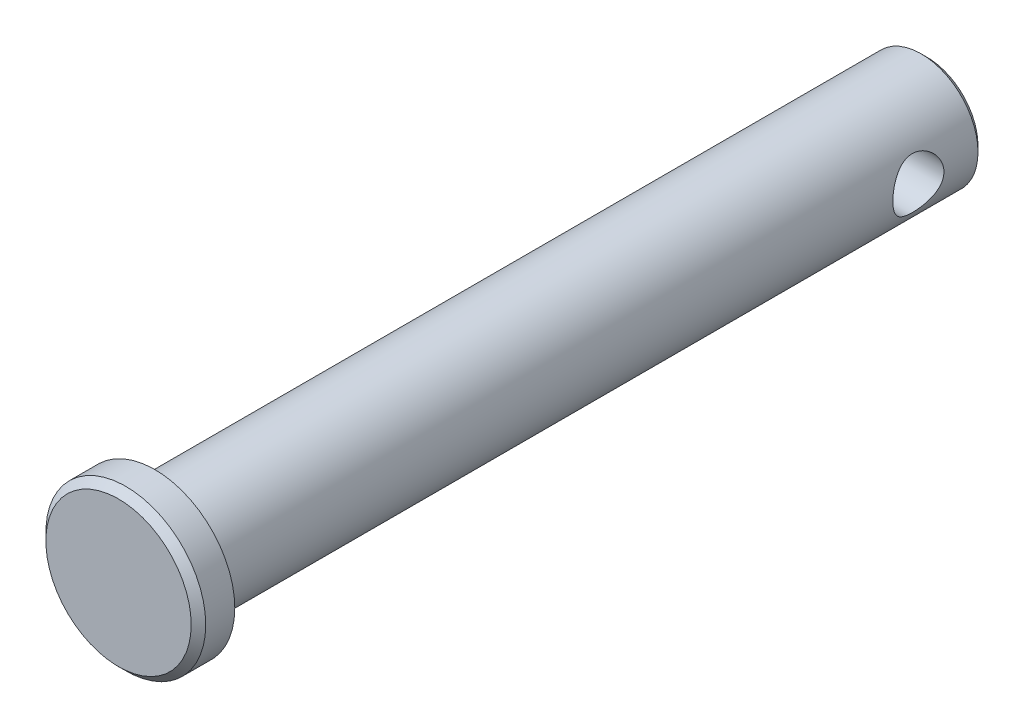
ISO-10303-21;
HEADER;
FILE_DESCRIPTION(('STEP AP214'),'2;1');
FILE_NAME('part.step','',(''),(''),'','','');
FILE_SCHEMA(('AUTOMOTIVE_DESIGN { 1 0 10303 214 1 1 1 1 }'));
ENDSEC;
DATA;
#1=APPLICATION_CONTEXT('core data for automotive mechanical design processes');
#2=APPLICATION_PROTOCOL_DEFINITION('international standard','automotive_design',2000,#1);
#3=PRODUCT_CONTEXT('',#1,'mechanical');
#4=PRODUCT('Part','Part','',(#3));
#5=PRODUCT_RELATED_PRODUCT_CATEGORY('part','',(#4));
#6=PRODUCT_DEFINITION_FORMATION('','',#4);
#7=PRODUCT_DEFINITION_CONTEXT('part definition',#1,'design');
#8=PRODUCT_DEFINITION('design','',#6,#7);
#9=PRODUCT_DEFINITION_SHAPE('','',#8);
#10=(LENGTH_UNIT() NAMED_UNIT(*) SI_UNIT(.MILLI.,.METRE.));
#11=(NAMED_UNIT(*) PLANE_ANGLE_UNIT() SI_UNIT($,.RADIAN.));
#12=(NAMED_UNIT(*) SI_UNIT($,.STERADIAN.) SOLID_ANGLE_UNIT());
#13=UNCERTAINTY_MEASURE_WITH_UNIT(LENGTH_MEASURE(1.E-05),#10,'distance_accuracy_value','');
#14=(GEOMETRIC_REPRESENTATION_CONTEXT(3) GLOBAL_UNCERTAINTY_ASSIGNED_CONTEXT((#13)) GLOBAL_UNIT_ASSIGNED_CONTEXT((#10,
#11,#12)) REPRESENTATION_CONTEXT('',''));
#15=CARTESIAN_POINT('',(0.,0.,0.));
#16=DIRECTION('',(0.,0.,1.));
#17=DIRECTION('',(1.,0.,0.));
#18=AXIS2_PLACEMENT_3D('',#15,#16,#17);
#19=CARTESIAN_POINT('',(0.,0.,26.9875));
#20=DIRECTION('',(0.,0.,-1.));
#21=DIRECTION('',(-1.,0.,0.));
#22=AXIS2_PLACEMENT_3D('',#19,#20,#21);
#23=CYLINDRICAL_SURFACE('',#22,3.96875);
#24=CARTESIAN_POINT('',(0.,0.,-26.590625));
#25=DIRECTION('',(0.,0.,1.));
#26=DIRECTION('',(1.,0.,0.));
#27=AXIS2_PLACEMENT_3D('',#24,#25,#26);
#28=CIRCLE('',#27,3.96875);
#29=CARTESIAN_POINT('',(3.96875,0.,-26.590625));
#30=VERTEX_POINT('',#29);
#31=EDGE_CURVE('E39',#30,#30,#28,.T.);
#32=ORIENTED_EDGE('',*,*,#31,.T.);
#33=EDGE_LOOP('',(#32));
#34=FACE_BOUND('',#33,.T.);
#35=CARTESIAN_POINT('',(-3.96875,0.,-20.6375));
#36=CARTESIAN_POINT('',(-3.96874617438622,-0.0949778738234462,-20.6375046427767));
#37=CARTESIAN_POINT('',(-3.96530259934115,-0.190100910102062,-20.6451211474799));
#38=CARTESIAN_POINT('',(-3.95186976524683,-0.377603398261745,-20.6752821054392));
#39=CARTESIAN_POINT('',(-3.94186507359599,-0.469975843546831,-20.6978617552799));
#40=CARTESIAN_POINT('',(-3.91637069606117,-0.648968721826523,-20.7569262458808));
#41=CARTESIAN_POINT('',(-3.90090078285467,-0.735608570631181,-20.7933609959748));
#42=CARTESIAN_POINT('',(-3.86594877361354,-0.901447999285701,-20.8788743710802));
#43=CARTESIAN_POINT('',(-3.84646753179613,-0.980649157993284,-20.9279503046938));
#44=CARTESIAN_POINT('',(-3.80416954815373,-1.13398432523679,-21.0402723638741));
#45=CARTESIAN_POINT('',(-3.7812323323631,-1.20764366282281,-21.1041206015973));
#46=CARTESIAN_POINT('',(-3.73507740763258,-1.34362938308817,-21.2428950283803));
#47=CARTESIAN_POINT('',(-3.71185953645299,-1.40594884000918,-21.3178279370255));
#48=CARTESIAN_POINT('',(-3.66620670648197,-1.52117571586779,-21.4820331682094));
#49=CARTESIAN_POINT('',(-3.64390071699522,-1.57330159549786,-21.5718936932781));
#50=CARTESIAN_POINT('',(-3.60455031138587,-1.66148802946916,-21.7602446575103));
#51=CARTESIAN_POINT('',(-3.58750275311297,-1.69755818356413,-21.8587298976649));
#52=CARTESIAN_POINT('',(-3.56192529512775,-1.75056975181475,-22.056084616897));
#53=CARTESIAN_POINT('',(-3.55298881993969,-1.76843057064752,-22.1546521796414));
#54=CARTESIAN_POINT('',(-3.54350139065343,-1.78737214090788,-22.3537584741968));
#55=CARTESIAN_POINT('',(-3.54294461635166,-1.78846453901733,-22.4542957892951));
#56=CARTESIAN_POINT('',(-3.54994141249622,-1.77452269382132,-22.6445619163113));
#57=CARTESIAN_POINT('',(-3.55675159739714,-1.76096672628881,-22.7344322875282));
#58=CARTESIAN_POINT('',(-3.57644085651669,-1.72062366969459,-22.9104523188023));
#59=CARTESIAN_POINT('',(-3.58932134024889,-1.6938335076046,-22.9966011096402));
#60=CARTESIAN_POINT('',(-3.61999879597095,-1.62725210855022,-23.1650688156485));
#61=CARTESIAN_POINT('',(-3.63790043052348,-1.58718038036525,-23.247256944716));
#62=CARTESIAN_POINT('',(-3.67658878575605,-1.49537598597763,-23.4040950627164));
#63=CARTESIAN_POINT('',(-3.69737673266191,-1.44363835775408,-23.4787418243522));
#64=CARTESIAN_POINT('',(-3.74202161728027,-1.32390460607897,-23.6262470977053));
#65=CARTESIAN_POINT('',(-3.76597742851696,-1.25479921909777,-23.6981780777331));
#66=CARTESIAN_POINT('',(-3.81252979441669,-1.10531402437862,-23.8297706801132));
#67=CARTESIAN_POINT('',(-3.83512591597318,-1.02493065110592,-23.8894284075093));
#68=CARTESIAN_POINT('',(-3.87728164517011,-0.851950400611567,-23.9964624966866));
#69=CARTESIAN_POINT('',(-3.89672549715337,-0.759052301739586,-24.0434011333037));
#70=CARTESIAN_POINT('',(-3.92946512008061,-0.565578480308636,-24.1206480148423));
#71=CARTESIAN_POINT('',(-3.94276486430751,-0.465007768662619,-24.150967009758));
#72=CARTESIAN_POINT('',(-3.96093706398566,-0.266740423937717,-24.1920331552533));
#73=CARTESIAN_POINT('',(-3.96634260111458,-0.169349837037099,-24.2040212438187));
#74=CARTESIAN_POINT('',(-3.96986639576799,0.0261960161241928,-24.2118589404276));
#75=CARTESIAN_POINT('',(-3.96798721258835,0.124351001740544,-24.2077142163107));
#76=CARTESIAN_POINT('',(-3.9574884590475,0.312425077700258,-24.1842349306814));
#77=CARTESIAN_POINT('',(-3.94927933787845,0.402485338607084,-24.1658250159671));
#78=CARTESIAN_POINT('',(-3.92741674577169,0.578108898424094,-24.1156862033162));
#79=CARTESIAN_POINT('',(-3.91376261909991,0.663671654301141,-24.0839557011765));
#80=CARTESIAN_POINT('',(-3.88175972760448,0.830900107030836,-24.0070762664853));
#81=CARTESIAN_POINT('',(-3.86327809956836,0.912361689031191,-23.9615405132584));
#82=CARTESIAN_POINT('',(-3.82352241163919,1.0667805898273,-23.8587646377431));
#83=CARTESIAN_POINT('',(-3.80224713175163,1.13973416672261,-23.8015193957655));
#84=CARTESIAN_POINT('',(-3.7569861365271,1.28140881747875,-23.6714582979106));
#85=CARTESIAN_POINT('',(-3.73292154548769,1.34928558884681,-23.5977480267837));
#86=CARTESIAN_POINT('',(-3.68626006612451,1.47199966484125,-23.4397069274033));
#87=CARTESIAN_POINT('',(-3.66366374315174,1.52683196811846,-23.3553720444865));
#88=CARTESIAN_POINT('',(-3.6220582670028,1.62311458805353,-23.1755854798547));
#89=CARTESIAN_POINT('',(-3.60315571336035,1.6641865299815,-23.0799045361922));
#90=CARTESIAN_POINT('',(-3.57239877714008,1.72923710343425,-22.8818548110904));
#91=CARTESIAN_POINT('',(-3.5605372740767,1.75323300854316,-22.7794929026995));
#92=CARTESIAN_POINT('',(-3.54641768025877,1.78160782388325,-22.5804829916353));
#93=CARTESIAN_POINT('',(-3.54341998323755,1.78749927212071,-22.4841029311388));
#94=CARTESIAN_POINT('',(-3.54535000484541,1.78366948684158,-22.2917459226279));
#95=CARTESIAN_POINT('',(-3.55027591495678,1.77395181601726,-22.1957688876381));
#96=CARTESIAN_POINT('',(-3.56677687348632,1.74051392909838,-22.013253041163));
#97=CARTESIAN_POINT('',(-3.57791211367527,1.71771729466601,-21.9265010549911));
#98=CARTESIAN_POINT('',(-3.6051626662439,1.65975853119642,-21.7580710308186));
#99=CARTESIAN_POINT('',(-3.62127942761947,1.62459280389832,-21.6763944774435));
#100=CARTESIAN_POINT('',(-3.65796501776635,1.54029485813948,-21.5146393255862));
#101=CARTESIAN_POINT('',(-3.67875446372189,1.49040607677893,-21.435006198301));
#102=CARTESIAN_POINT('',(-3.7219314339033,1.37904587307234,-21.2847730048114));
#103=CARTESIAN_POINT('',(-3.74431964392808,1.31756946138292,-21.21417685177));
#104=CARTESIAN_POINT('',(-3.7906044226433,1.17819988334134,-21.0774100431823));
#105=CARTESIAN_POINT('',(-3.81445387976054,1.09932398288879,-21.0122198054072));
#106=CARTESIAN_POINT('',(-3.85900563461188,0.930928545506918,-20.8958857784195));
#107=CARTESIAN_POINT('',(-3.87970648291034,0.841404140216964,-20.8447484496596));
#108=CARTESIAN_POINT('',(-3.91548302476265,0.654900541569406,-20.7587695978331));
#109=CARTESIAN_POINT('',(-3.9306127661094,0.55800461146758,-20.723770622202));
#110=CARTESIAN_POINT('',(-3.95373955592654,0.358998712324301,-20.6709461799785));
#111=CARTESIAN_POINT('',(-3.9617582306156,0.256905557576824,-20.6530686302521));
#112=CARTESIAN_POINT('',(-3.96675460869473,0.128456865581506,-20.6419387628093));
#113=CARTESIAN_POINT('',(-3.96750154708539,0.102802547124715,-20.6402758382382));
#114=CARTESIAN_POINT('',(-3.96849976418159,0.0514357022290038,-20.6380558205572));
#115=CARTESIAN_POINT('',(-3.96875103610376,0.0257231749982957,-20.6374987425813));
#116=CARTESIAN_POINT('',(-3.96875,0.,-20.6375));
#117=B_SPLINE_CURVE_WITH_KNOTS('',3,(#35,#36,#37,#38,#39,#40,#41,#42,#43,#44,#45,#46,#47,#48,
#49,#50,#51,#52,#53,#54,#55,#56,#57,#58,#59,#60,#61,#62,#63,#64,#65,#66,#67,#68,#69,#70,#71,#72,
#73,#74,#75,#76,#77,#78,#79,#80,#81,#82,#83,#84,#85,#86,#87,#88,#89,#90,#91,#92,#93,#94,#95,#96,
#97,#98,#99,#100,#101,#102,#103,#104,#105,#106,#107,#108,#109,#110,#111,#112,#113,#114,#115,
#116),.UNSPECIFIED.,.T.,.F.,(4,2,2,2,2,2,2,2,2,2,2,2,2,2,2,2,2,2,2,2,2,2,2,2,2,2,2,2,2,2,2,2,2,
2,2,2,2,2,2,2,4),(0.,0.284828038773507,0.570328444753487,0.854806339300565,1.13922371647665,
1.43836698800565,1.73769235057742,2.05484351698026,2.37180480245164,2.67182404149381,
2.97163488960178,3.24379026768139,3.51600887095951,3.79438770250797,4.07288516494024,
4.37926965204658,4.68575122177785,5.00172742428918,5.31749900370299,5.6107643968995,
5.9039267683125,6.17953050358859,6.45516743944876,6.73938144201626,7.02371997688967,
7.33149162707356,7.63938108977513,7.95514987865638,8.27059878990355,8.55885899679168,
8.84705341928244,9.11703762338688,9.38710043294565,9.67464025936009,9.96230417721748,
10.2760302632386,10.5899003361528,10.9006397585277,11.2104308849967,11.2875707589972,
11.3647116886774),.UNSPECIFIED.);
#118=CARTESIAN_POINT('',(-3.96875,0.,-20.6375));
#119=VERTEX_POINT('',#118);
#120=EDGE_CURVE('E50',#119,#119,#117,.T.);
#121=ORIENTED_EDGE('',*,*,#120,.T.);
#122=EDGE_LOOP('',(#121));
#123=FACE_BOUND('',#122,.T.);
#124=CARTESIAN_POINT('',(3.96875,0.,-24.209375));
#125=CARTESIAN_POINT('',(3.96874617438622,-0.0949778738234462,-24.2093703572233));
#126=CARTESIAN_POINT('',(3.96530259934115,-0.190100910102062,-24.2017538525201));
#127=CARTESIAN_POINT('',(3.95186976524683,-0.377603398261745,-24.1715928945608));
#128=CARTESIAN_POINT('',(3.94186507359599,-0.469975843546831,-24.1490132447201));
#129=CARTESIAN_POINT('',(3.91637069606117,-0.648968721826523,-24.0899487541192));
#130=CARTESIAN_POINT('',(3.90090078285467,-0.735608570631181,-24.0535140040252));
#131=CARTESIAN_POINT('',(3.86594877361354,-0.901447999285701,-23.9680006289198));
#132=CARTESIAN_POINT('',(3.84646753179613,-0.980649157993284,-23.9189246953062));
#133=CARTESIAN_POINT('',(3.80416954815373,-1.13398432523679,-23.8066026361259));
#134=CARTESIAN_POINT('',(3.7812323323631,-1.20764366282281,-23.7427543984027));
#135=CARTESIAN_POINT('',(3.73507740763258,-1.34362938308817,-23.6039799716197));
#136=CARTESIAN_POINT('',(3.71185953645299,-1.40594884000918,-23.5290470629745));
#137=CARTESIAN_POINT('',(3.66620670648197,-1.52117571586779,-23.3648418317906));
#138=CARTESIAN_POINT('',(3.64390071699522,-1.57330159549786,-23.2749813067219));
#139=CARTESIAN_POINT('',(3.60455031138587,-1.66148802946916,-23.0866303424897));
#140=CARTESIAN_POINT('',(3.58750275311297,-1.69755818356413,-22.9881451023351));
#141=CARTESIAN_POINT('',(3.56192529512775,-1.75056975181475,-22.790790383103));
#142=CARTESIAN_POINT('',(3.55298881993969,-1.76843057064752,-22.6922228203586));
#143=CARTESIAN_POINT('',(3.54350139065343,-1.78737214090788,-22.4931165258032));
#144=CARTESIAN_POINT('',(3.54294461635166,-1.78846453901733,-22.3925792107049));
#145=CARTESIAN_POINT('',(3.54994141249622,-1.77452269382132,-22.2023130836887));
#146=CARTESIAN_POINT('',(3.55675159739714,-1.76096672628881,-22.1124427124718));
#147=CARTESIAN_POINT('',(3.57644085651669,-1.72062366969459,-21.9364226811977));
#148=CARTESIAN_POINT('',(3.58932134024889,-1.6938335076046,-21.8502738903598));
#149=CARTESIAN_POINT('',(3.61999879597095,-1.62725210855022,-21.6818061843515));
#150=CARTESIAN_POINT('',(3.63790043052348,-1.58718038036525,-21.599618055284));
#151=CARTESIAN_POINT('',(3.67658878575605,-1.49537598597763,-21.4427799372836));
#152=CARTESIAN_POINT('',(3.69737673266191,-1.44363835775408,-21.3681331756478));
#153=CARTESIAN_POINT('',(3.74202161728027,-1.32390460607897,-21.2206279022947));
#154=CARTESIAN_POINT('',(3.76597742851696,-1.25479921909777,-21.148696922267));
#155=CARTESIAN_POINT('',(3.81252979441669,-1.10531402437862,-21.0171043198868));
#156=CARTESIAN_POINT('',(3.83512591597318,-1.02493065110592,-20.9574465924907));
#157=CARTESIAN_POINT('',(3.87728164517011,-0.851950400611567,-20.8504125033134));
#158=CARTESIAN_POINT('',(3.89672549715337,-0.759052301739586,-20.8034738666963));
#159=CARTESIAN_POINT('',(3.92946512008061,-0.565578480308636,-20.7262269851577));
#160=CARTESIAN_POINT('',(3.94276486430751,-0.465007768662619,-20.695907990242));
#161=CARTESIAN_POINT('',(3.96093706398566,-0.266740423937717,-20.6548418447467));
#162=CARTESIAN_POINT('',(3.96634260111458,-0.169349837037099,-20.6428537561813));
#163=CARTESIAN_POINT('',(3.96986639576799,0.0261960161241928,-20.6350160595724));
#164=CARTESIAN_POINT('',(3.96798721258835,0.124351001740544,-20.6391607836893));
#165=CARTESIAN_POINT('',(3.9574884590475,0.312425077700258,-20.6626400693186));
#166=CARTESIAN_POINT('',(3.94927933787845,0.402485338607084,-20.6810499840329));
#167=CARTESIAN_POINT('',(3.92741674577169,0.578108898424094,-20.7311887966838));
#168=CARTESIAN_POINT('',(3.91376261909991,0.663671654301141,-20.7629192988235));
#169=CARTESIAN_POINT('',(3.88175972760448,0.830900107030836,-20.8397987335147));
#170=CARTESIAN_POINT('',(3.86327809956836,0.912361689031191,-20.8853344867416));
#171=CARTESIAN_POINT('',(3.82352241163919,1.0667805898273,-20.9881103622569));
#172=CARTESIAN_POINT('',(3.80224713175163,1.13973416672261,-21.0453556042345));
#173=CARTESIAN_POINT('',(3.7569861365271,1.28140881747875,-21.1754167020894));
#174=CARTESIAN_POINT('',(3.73292154548769,1.34928558884681,-21.2491269732163));
#175=CARTESIAN_POINT('',(3.68626006612451,1.47199966484125,-21.4071680725967));
#176=CARTESIAN_POINT('',(3.66366374315174,1.52683196811846,-21.4915029555135));
#177=CARTESIAN_POINT('',(3.6220582670028,1.62311458805353,-21.6712895201453));
#178=CARTESIAN_POINT('',(3.60315571336035,1.6641865299815,-21.7669704638078));
#179=CARTESIAN_POINT('',(3.57239877714008,1.72923710343425,-21.9650201889096));
#180=CARTESIAN_POINT('',(3.5605372740767,1.75323300854316,-22.0673820973005));
#181=CARTESIAN_POINT('',(3.54641768025877,1.78160782388325,-22.2663920083647));
#182=CARTESIAN_POINT('',(3.54341998323755,1.78749927212071,-22.3627720688612));
#183=CARTESIAN_POINT('',(3.54535000484541,1.78366948684158,-22.5551290773721));
#184=CARTESIAN_POINT('',(3.55027591495678,1.77395181601726,-22.6511061123619));
#185=CARTESIAN_POINT('',(3.56677687348632,1.74051392909838,-22.833621958837));
#186=CARTESIAN_POINT('',(3.57791211367527,1.71771729466601,-22.9203739450089));
#187=CARTESIAN_POINT('',(3.6051626662439,1.65975853119642,-23.0888039691814));
#188=CARTESIAN_POINT('',(3.62127942761947,1.62459280389832,-23.1704805225565));
#189=CARTESIAN_POINT('',(3.65796501776635,1.54029485813948,-23.3322356744138));
#190=CARTESIAN_POINT('',(3.67875446372189,1.49040607677893,-23.411868801699));
#191=CARTESIAN_POINT('',(3.7219314339033,1.37904587307233,-23.5621019951886));
#192=CARTESIAN_POINT('',(3.74431964392808,1.31756946138292,-23.63269814823));
#193=CARTESIAN_POINT('',(3.7906044226433,1.17819988334134,-23.7694649568177));
#194=CARTESIAN_POINT('',(3.81445387976054,1.09932398288879,-23.8346551945928));
#195=CARTESIAN_POINT('',(3.85900563461188,0.930928545506918,-23.9509892215805));
#196=CARTESIAN_POINT('',(3.87970648291034,0.841404140216964,-24.0021265503404));
#197=CARTESIAN_POINT('',(3.91548302476265,0.654900541569406,-24.0881054021669));
#198=CARTESIAN_POINT('',(3.9306127661094,0.55800461146758,-24.123104377798));
#199=CARTESIAN_POINT('',(3.95373955592654,0.358998712324301,-24.1759288200215));
#200=CARTESIAN_POINT('',(3.9617582306156,0.256905557576824,-24.1938063697479));
#201=CARTESIAN_POINT('',(3.96675460869473,0.128456865581506,-24.2049362371907));
#202=CARTESIAN_POINT('',(3.96750154708539,0.102802547124716,-24.2065991617618));
#203=CARTESIAN_POINT('',(3.96849976418159,0.0514357022290041,-24.2088191794428));
#204=CARTESIAN_POINT('',(3.96875103610376,0.0257231749982958,-24.2093762574187));
#205=CARTESIAN_POINT('',(3.96875,0.,-24.209375));
#206=B_SPLINE_CURVE_WITH_KNOTS('',3,(#124,#125,#126,#127,#128,#129,#130,#131,#132,#133,#134,
#135,#136,#137,#138,#139,#140,#141,#142,#143,#144,#145,#146,#147,#148,#149,#150,#151,#152,#153,
#154,#155,#156,#157,#158,#159,#160,#161,#162,#163,#164,#165,#166,#167,#168,#169,#170,#171,#172,
#173,#174,#175,#176,#177,#178,#179,#180,#181,#182,#183,#184,#185,#186,#187,#188,#189,#190,#191,
#192,#193,#194,#195,#196,#197,#198,#199,#200,#201,#202,#203,#204,#205),.UNSPECIFIED.,.T.,.F.,(4,
2,2,2,2,2,2,2,2,2,2,2,2,2,2,2,2,2,2,2,2,2,2,2,2,2,2,2,2,2,2,2,2,2,2,2,2,2,2,2,4),(0.,
0.284828038773507,0.570328444753487,0.854806339300565,1.13922371647665,1.43836698800565,
1.73769235057742,2.05484351698026,2.37180480245164,2.67182404149381,2.97163488960178,
3.24379026768139,3.51600887095951,3.79438770250797,4.07288516494024,4.37926965204658,
4.68575122177785,5.00172742428918,5.31749900370299,5.6107643968995,5.9039267683125,
6.17953050358859,6.45516743944876,6.73938144201626,7.02371997688967,7.33149162707356,
7.63938108977513,7.95514987865638,8.27059878990355,8.55885899679168,8.84705341928244,
9.11703762338688,9.38710043294565,9.67464025936009,9.96230417721748,10.2760302632386,
10.5899003361528,10.9006397585277,11.2104308849967,11.2875707589972,11.3647116886774),.UNSPECIFIED.);
#207=CARTESIAN_POINT('',(3.96875,0.,-24.209375));
#208=VERTEX_POINT('',#207);
#209=EDGE_CURVE('E59',#208,#208,#206,.T.);
#210=ORIENTED_EDGE('',*,*,#209,.T.);
#211=EDGE_LOOP('',(#210));
#212=FACE_BOUND('',#211,.T.);
#213=CARTESIAN_POINT('',(0.,0.,26.9875));
#214=DIRECTION('',(0.,0.,1.));
#215=DIRECTION('',(1.,0.,0.));
#216=AXIS2_PLACEMENT_3D('',#213,#214,#215);
#217=CIRCLE('',#216,3.96875);
#218=CARTESIAN_POINT('',(3.96875,0.,26.9875));
#219=VERTEX_POINT('',#218);
#220=EDGE_CURVE('E98',#219,#219,#217,.T.);
#221=ORIENTED_EDGE('',*,*,#220,.F.);
#222=EDGE_LOOP('',(#221));
#223=FACE_BOUND('',#222,.T.);
#224=ADVANCED_FACE('F32',(#34,#123,#212,#223),#23,.T.);
#225=CARTESIAN_POINT('',(0.,0.,-26.9875));
#226=DIRECTION('',(0.,0.,1.));
#227=DIRECTION('',(1.,0.,0.));
#228=AXIS2_PLACEMENT_3D('',#225,#226,#227);
#229=PLANE('',#228);
#230=CARTESIAN_POINT('',(0.,0.,-26.9875));
#231=DIRECTION('',(0.,0.,1.));
#232=DIRECTION('',(1.,0.,0.));
#233=AXIS2_PLACEMENT_3D('',#230,#231,#232);
#234=CIRCLE('',#233,3.571875);
#235=CARTESIAN_POINT('',(3.571875,0.,-26.9875));
#236=VERTEX_POINT('',#235);
#237=EDGE_CURVE('E10',#236,#236,#234,.F.);
#238=ORIENTED_EDGE('',*,*,#237,.T.);
#239=EDGE_LOOP('',(#238));
#240=FACE_BOUND('',#239,.T.);
#241=ADVANCED_FACE('F80',(#240),#229,.F.);
#242=CARTESIAN_POINT('',(0.,0.,26.9875));
#243=DIRECTION('',(0.,0.,1.));
#244=DIRECTION('',(1.,0.,0.));
#245=AXIS2_PLACEMENT_3D('',#242,#243,#244);
#246=PLANE('',#245);
#247=CARTESIAN_POINT('',(0.,0.,26.9875));
#248=DIRECTION('',(0.,0.,1.));
#249=DIRECTION('',(1.,0.,0.));
#250=AXIS2_PLACEMENT_3D('',#247,#248,#249);
#251=CIRCLE('',#250,5.588);
#252=CARTESIAN_POINT('',(5.588,0.,26.9875));
#253=VERTEX_POINT('',#252);
#254=EDGE_CURVE('E58',#253,#253,#251,.T.);
#255=ORIENTED_EDGE('',*,*,#254,.F.);
#256=EDGE_LOOP('',(#255));
#257=FACE_BOUND('',#256,.T.);
#258=ORIENTED_EDGE('',*,*,#220,.T.);
#259=EDGE_LOOP('',(#258));
#260=FACE_BOUND('',#259,.T.);
#261=ADVANCED_FACE('F77',(#257,#260),#246,.F.);
#262=CARTESIAN_POINT('',(0.,0.,29.5275));
#263=DIRECTION('',(0.,0.,-1.));
#264=DIRECTION('',(-1.,0.,0.));
#265=AXIS2_PLACEMENT_3D('',#262,#263,#264);
#266=CYLINDRICAL_SURFACE('',#265,5.588);
#267=CARTESIAN_POINT('',(0.,0.,29.0195));
#268=DIRECTION('',(0.,0.,1.));
#269=DIRECTION('',(1.,0.,0.));
#270=AXIS2_PLACEMENT_3D('',#267,#268,#269);
#271=CIRCLE('',#270,5.588);
#272=CARTESIAN_POINT('',(5.588,0.,29.0195));
#273=VERTEX_POINT('',#272);
#274=EDGE_CURVE('E43',#273,#273,#271,.F.);
#275=ORIENTED_EDGE('',*,*,#274,.T.);
#276=EDGE_LOOP('',(#275));
#277=FACE_BOUND('',#276,.T.);
#278=ORIENTED_EDGE('',*,*,#254,.T.);
#279=EDGE_LOOP('',(#278));
#280=FACE_BOUND('',#279,.T.);
#281=ADVANCED_FACE('F75',(#277,#280),#266,.T.);
#282=CARTESIAN_POINT('',(0.,0.,29.5275));
#283=DIRECTION('',(0.,0.,1.));
#284=DIRECTION('',(1.,0.,0.));
#285=AXIS2_PLACEMENT_3D('',#282,#283,#284);
#286=PLANE('',#285);
#287=CARTESIAN_POINT('',(0.,0.,29.5275));
#288=DIRECTION('',(0.,0.,1.));
#289=DIRECTION('',(1.,0.,0.));
#290=AXIS2_PLACEMENT_3D('',#287,#288,#289);
#291=CIRCLE('',#290,5.07999999999998);
#292=CARTESIAN_POINT('',(5.07999999999998,0.,29.5275));
#293=VERTEX_POINT('',#292);
#294=EDGE_CURVE('E47',#293,#293,#291,.T.);
#295=ORIENTED_EDGE('',*,*,#294,.T.);
#296=EDGE_LOOP('',(#295));
#297=FACE_BOUND('',#296,.T.);
#298=ADVANCED_FACE('F71',(#297),#286,.T.);
#299=CARTESIAN_POINT('',(0.,0.,29.5275));
#300=DIRECTION('',(0.,0.,-1.));
#301=DIRECTION('',(-1.,0.,0.));
#302=AXIS2_PLACEMENT_3D('',#299,#300,#301);
#303=CONICAL_SURFACE('',#302,5.07999999999998,0.785398163397449);
#304=ORIENTED_EDGE('',*,*,#274,.F.);
#305=EDGE_LOOP('',(#304));
#306=FACE_BOUND('',#305,.T.);
#307=ORIENTED_EDGE('',*,*,#294,.F.);
#308=EDGE_LOOP('',(#307));
#309=FACE_BOUND('',#308,.T.);
#310=ADVANCED_FACE('F69',(#306,#309),#303,.T.);
#311=CARTESIAN_POINT('',(-5.588,0.,-22.4234375));
#312=DIRECTION('',(1.,0.,0.));
#313=DIRECTION('',(0.,0.,-1.));
#314=AXIS2_PLACEMENT_3D('',#311,#312,#313);
#315=CYLINDRICAL_SURFACE('',#314,1.7859375);
#316=ORIENTED_EDGE('',*,*,#209,.F.);
#317=EDGE_LOOP('',(#316));
#318=FACE_BOUND('',#317,.T.);
#319=ORIENTED_EDGE('',*,*,#120,.F.);
#320=EDGE_LOOP('',(#319));
#321=FACE_BOUND('',#320,.T.);
#322=ADVANCED_FACE('F65',(#318,#321),#315,.F.);
#323=CARTESIAN_POINT('',(0.,0.,-26.590625));
#324=DIRECTION('',(0.,0.,1.));
#325=DIRECTION('',(1.,0.,0.));
#326=AXIS2_PLACEMENT_3D('',#323,#324,#325);
#327=CONICAL_SURFACE('',#326,3.96875,0.785398163397448);
#328=ORIENTED_EDGE('',*,*,#237,.F.);
#329=EDGE_LOOP('',(#328));
#330=FACE_BOUND('',#329,.T.);
#331=ORIENTED_EDGE('',*,*,#31,.F.);
#332=EDGE_LOOP('',(#331));
#333=FACE_BOUND('',#332,.T.);
#334=ADVANCED_FACE('F34',(#330,#333),#327,.T.);
#335=CLOSED_SHELL('',(#224,#241,#261,#281,#298,#310,#322,#334));
#336=MANIFOLD_SOLID_BREP('B2',#335);
#337=ADVANCED_BREP_SHAPE_REPRESENTATION('',(#18,#336),#14);
#338=SHAPE_DEFINITION_REPRESENTATION(#9,#337);
ENDSEC;
END-ISO-10303-21;
